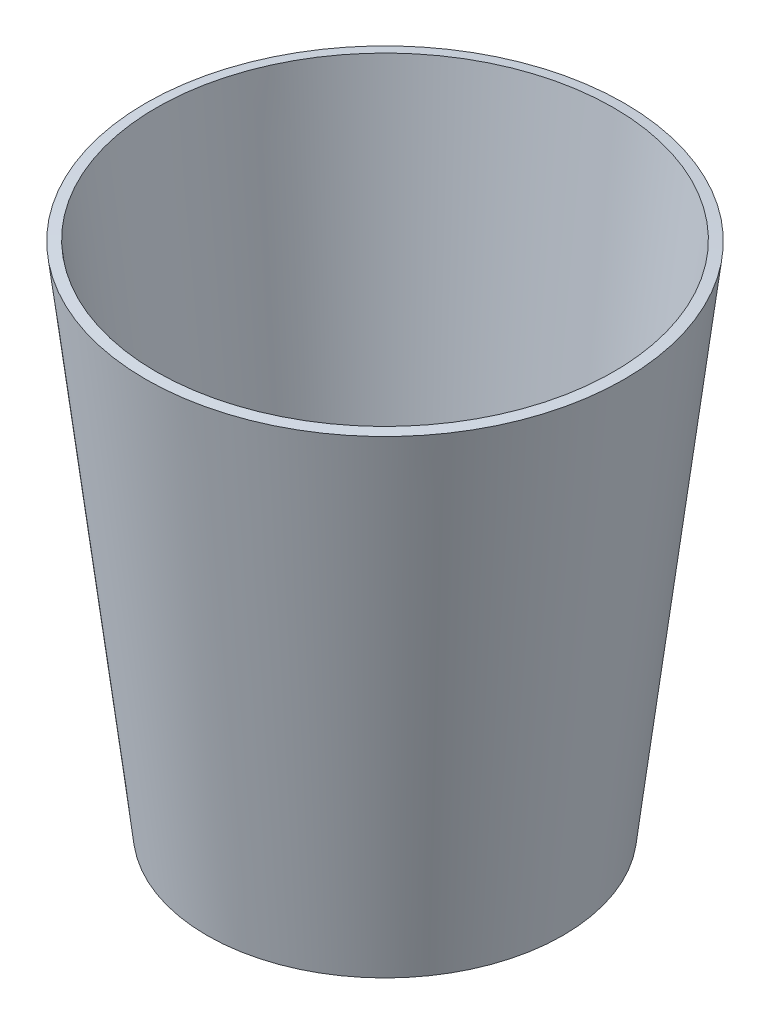
ISO-10303-21;
HEADER;
FILE_DESCRIPTION(('STEP AP214'),'2;1');
FILE_NAME('part.step','',(''),(''),'','','');
FILE_SCHEMA(('AUTOMOTIVE_DESIGN { 1 0 10303 214 1 1 1 1 }'));
ENDSEC;
DATA;
#1=APPLICATION_CONTEXT('core data for automotive mechanical design processes');
#2=APPLICATION_PROTOCOL_DEFINITION('international standard','automotive_design',2000,#1);
#3=PRODUCT_CONTEXT('',#1,'mechanical');
#4=PRODUCT('Part','Part','',(#3));
#5=PRODUCT_RELATED_PRODUCT_CATEGORY('part','',(#4));
#6=PRODUCT_DEFINITION_FORMATION('','',#4);
#7=PRODUCT_DEFINITION_CONTEXT('part definition',#1,'design');
#8=PRODUCT_DEFINITION('design','',#6,#7);
#9=PRODUCT_DEFINITION_SHAPE('','',#8);
#10=(LENGTH_UNIT() NAMED_UNIT(*) SI_UNIT(.MILLI.,.METRE.));
#11=(NAMED_UNIT(*) PLANE_ANGLE_UNIT() SI_UNIT($,.RADIAN.));
#12=(NAMED_UNIT(*) SI_UNIT($,.STERADIAN.) SOLID_ANGLE_UNIT());
#13=UNCERTAINTY_MEASURE_WITH_UNIT(LENGTH_MEASURE(1.E-05),#10,'distance_accuracy_value','');
#14=(GEOMETRIC_REPRESENTATION_CONTEXT(3) GLOBAL_UNCERTAINTY_ASSIGNED_CONTEXT((#13)) GLOBAL_UNIT_ASSIGNED_CONTEXT((#10,
#11,#12)) REPRESENTATION_CONTEXT('',''));
#15=CARTESIAN_POINT('',(0.,0.,0.));
#16=DIRECTION('',(0.,0.,1.));
#17=DIRECTION('',(1.,0.,0.));
#18=AXIS2_PLACEMENT_3D('',#15,#16,#17);
#19=CARTESIAN_POINT('',(0.,0.,0.));
#20=DIRECTION('',(0.,-1.,0.));
#21=DIRECTION('',(0.,0.,-1.));
#22=AXIS2_PLACEMENT_3D('',#19,#20,#21);
#23=CONICAL_SURFACE('',#22,31.5,1.45193940473408);
#24=CARTESIAN_POINT('',(0.,-0.237154543353955,0.));
#25=DIRECTION('',(0.,1.,0.));
#26=DIRECTION('',(0.,0.,1.));
#27=AXIS2_PLACEMENT_3D('',#24,#25,#26);
#28=CIRCLE('',#27,33.4858896551839);
#29=CARTESIAN_POINT('',(0.,-0.237154543353955,33.4858896551839));
#30=VERTEX_POINT('',#29);
#31=EDGE_CURVE('E60',#30,#30,#28,.T.);
#32=ORIENTED_EDGE('',*,*,#31,.F.);
#33=EDGE_LOOP('',(#32));
#34=FACE_BOUND('',#33,.T.);
#35=CARTESIAN_POINT('',(0.,0.,0.));
#36=DIRECTION('',(0.,1.,0.));
#37=DIRECTION('',(0.,0.,1.));
#38=AXIS2_PLACEMENT_3D('',#35,#36,#37);
#39=CIRCLE('',#38,31.5);
#40=CARTESIAN_POINT('',(0.,0.,31.5));
#41=VERTEX_POINT('',#40);
#42=EDGE_CURVE('E67',#41,#41,#39,.T.);
#43=ORIENTED_EDGE('',*,*,#42,.T.);
#44=EDGE_LOOP('',(#43));
#45=FACE_BOUND('',#44,.T.);
#46=ADVANCED_FACE('F51',(#34,#45),#23,.F.);
#47=CARTESIAN_POINT('',(0.,96.3,0.));
#48=DIRECTION('',(0.,-1.,0.));
#49=DIRECTION('',(0.,0.,-1.));
#50=AXIS2_PLACEMENT_3D('',#47,#48,#49);
#51=CONICAL_SURFACE('',#50,43.0001266386428,1.45193940473408);
#52=CARTESIAN_POINT('',(0.,96.062845456646,0.));
#53=DIRECTION('',(0.,1.,0.));
#54=DIRECTION('',(0.,0.,1.));
#55=AXIS2_PLACEMENT_3D('',#52,#53,#54);
#56=CIRCLE('',#55,44.9860162938267);
#57=CARTESIAN_POINT('',(0.,96.062845456646,44.9860162938267));
#58=VERTEX_POINT('',#57);
#59=EDGE_CURVE('E13',#58,#58,#56,.T.);
#60=ORIENTED_EDGE('',*,*,#59,.T.);
#61=EDGE_LOOP('',(#60));
#62=FACE_BOUND('',#61,.T.);
#63=CARTESIAN_POINT('',(0.,96.3,0.));
#64=DIRECTION('',(0.,-1.,0.));
#65=DIRECTION('',(0.,0.,-1.));
#66=AXIS2_PLACEMENT_3D('',#63,#64,#65);
#67=CIRCLE('',#66,43.0001266386428);
#68=CARTESIAN_POINT('',(0.,96.3,-43.0001266386428));
#69=VERTEX_POINT('',#68);
#70=EDGE_CURVE('E55',#69,#69,#67,.F.);
#71=ORIENTED_EDGE('',*,*,#70,.F.);
#72=EDGE_LOOP('',(#71));
#73=FACE_BOUND('',#72,.T.);
#74=ADVANCED_FACE('F53',(#62,#73),#51,.T.);
#75=CARTESIAN_POINT('',(0.,-0.237154543353955,0.));
#76=DIRECTION('',(0.,1.,0.));
#77=DIRECTION('',(0.,0.,1.));
#78=AXIS2_PLACEMENT_3D('',#75,#76,#77);
#79=CONICAL_SURFACE('',#78,33.4858896551839,0.118856922060814);
#80=ORIENTED_EDGE('',*,*,#31,.T.);
#81=EDGE_LOOP('',(#80));
#82=FACE_BOUND('',#81,.T.);
#83=ORIENTED_EDGE('',*,*,#59,.F.);
#84=EDGE_LOOP('',(#83));
#85=FACE_BOUND('',#84,.T.);
#86=ADVANCED_FACE('F79',(#82,#85),#79,.T.);
#87=CARTESIAN_POINT('',(0.,0.,0.));
#88=DIRECTION('',(0.,1.,0.));
#89=DIRECTION('',(0.,0.,1.));
#90=AXIS2_PLACEMENT_3D('',#87,#88,#89);
#91=CONICAL_SURFACE('',#90,31.5,0.118856922060814);
#92=ORIENTED_EDGE('',*,*,#42,.F.);
#93=EDGE_LOOP('',(#92));
#94=FACE_BOUND('',#93,.T.);
#95=ORIENTED_EDGE('',*,*,#70,.T.);
#96=EDGE_LOOP('',(#95));
#97=FACE_BOUND('',#96,.T.);
#98=ADVANCED_FACE('F76',(#94,#97),#91,.F.);
#99=CLOSED_SHELL('',(#46,#74,#86,#98));
#100=MANIFOLD_SOLID_BREP('B2',#99);
#101=CARTESIAN_POINT('',(0.,0.,0.));
#102=DIRECTION('',(0.,1.,0.));
#103=DIRECTION('',(0.,0.,1.));
#104=AXIS2_PLACEMENT_3D('',#101,#102,#103);
#105=PLANE('',#104);
#106=CARTESIAN_POINT('',(0.,0.,0.));
#107=DIRECTION('',(0.,1.,0.));
#108=DIRECTION('',(0.,0.,1.));
#109=AXIS2_PLACEMENT_3D('',#106,#107,#108);
#110=CIRCLE('',#109,31.5);
#111=CARTESIAN_POINT('',(0.,0.,31.5));
#112=VERTEX_POINT('',#111);
#113=EDGE_CURVE('E50',#112,#112,#110,.T.);
#114=ORIENTED_EDGE('',*,*,#113,.T.);
#115=EDGE_LOOP('',(#114));
#116=FACE_BOUND('',#115,.T.);
#117=ADVANCED_FACE('F117',(#116),#105,.T.);
#118=OPEN_SHELL('',(#117));
#119=SHELL_BASED_SURFACE_MODEL('B8',(#118));
#120=ADVANCED_BREP_SHAPE_REPRESENTATION('',(#18,#100),#14);
#121=MANIFOLD_SURFACE_SHAPE_REPRESENTATION('',(#18,#119),#14);
#122=SHAPE_REPRESENTATION('',(#18),#14);
#123=SHAPE_DEFINITION_REPRESENTATION(#9,#122);
#124=SHAPE_REPRESENTATION_RELATIONSHIP('','',#122,#120);
#125=SHAPE_REPRESENTATION_RELATIONSHIP('','',#122,#121);
ENDSEC;
END-ISO-10303-21;
